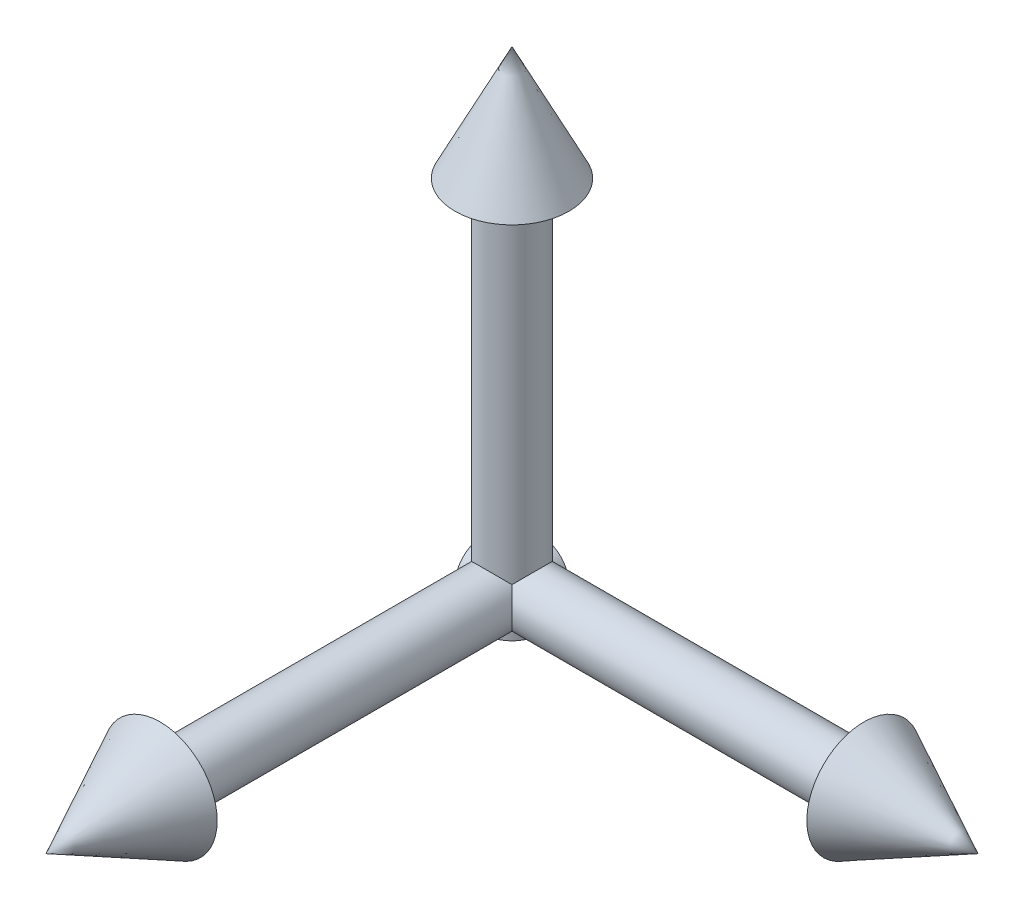
ISO-10303-21;
HEADER;
FILE_DESCRIPTION(('STEP AP214'),'2;1');
FILE_NAME('part.step','',(''),(''),'','','');
FILE_SCHEMA(('AUTOMOTIVE_DESIGN { 1 0 10303 214 1 1 1 1 }'));
ENDSEC;
DATA;
#1=APPLICATION_CONTEXT('core data for automotive mechanical design processes');
#2=APPLICATION_PROTOCOL_DEFINITION('international standard','automotive_design',2000,#1);
#3=PRODUCT_CONTEXT('',#1,'mechanical');
#4=PRODUCT('Part','Part','',(#3));
#5=PRODUCT_RELATED_PRODUCT_CATEGORY('part','',(#4));
#6=PRODUCT_DEFINITION_FORMATION('','',#4);
#7=PRODUCT_DEFINITION_CONTEXT('part definition',#1,'design');
#8=PRODUCT_DEFINITION('design','',#6,#7);
#9=PRODUCT_DEFINITION_SHAPE('','',#8);
#10=(LENGTH_UNIT() NAMED_UNIT(*) SI_UNIT(.MILLI.,.METRE.));
#11=(NAMED_UNIT(*) PLANE_ANGLE_UNIT() SI_UNIT($,.RADIAN.));
#12=(NAMED_UNIT(*) SI_UNIT($,.STERADIAN.) SOLID_ANGLE_UNIT());
#13=UNCERTAINTY_MEASURE_WITH_UNIT(LENGTH_MEASURE(1.E-05),#10,'distance_accuracy_value','');
#14=(GEOMETRIC_REPRESENTATION_CONTEXT(3) GLOBAL_UNCERTAINTY_ASSIGNED_CONTEXT((#13)) GLOBAL_UNIT_ASSIGNED_CONTEXT((#10,
#11,#12)) REPRESENTATION_CONTEXT('',''));
#15=CARTESIAN_POINT('',(0.,0.,0.));
#16=DIRECTION('',(0.,0.,1.));
#17=DIRECTION('',(1.,0.,0.));
#18=AXIS2_PLACEMENT_3D('',#15,#16,#17);
#19=CARTESIAN_POINT('',(55.5,4.5,0.));
#20=DIRECTION('',(-1.,0.,0.));
#21=DIRECTION('',(0.,-0.285012258072763,-0.958523871767555));
#22=AXIS2_PLACEMENT_3D('',#19,#20,#21);
#23=CYLINDRICAL_SURFACE('',#22,4.5);
#24=CARTESIAN_POINT('',(55.5,4.5,0.));
#25=DIRECTION('',(1.,0.,0.));
#26=DIRECTION('',(0.,0.285012258072763,0.958523871767555));
#27=AXIS2_PLACEMENT_3D('',#24,#25,#26);
#28=CIRCLE('',#27,4.5);
#29=CARTESIAN_POINT('',(55.5,5.78255516132744,4.31335742295393));
#30=VERTEX_POINT('',#29);
#31=EDGE_CURVE('E12',#30,#30,#28,.T.);
#32=ORIENTED_EDGE('',*,*,#31,.F.);
#33=EDGE_LOOP('',(#32));
#34=FACE_BOUND('',#33,.T.);
#35=CARTESIAN_POINT('',(-4.49999999999996,4.49999999999995,0.));
#36=DIRECTION('',(1.,0.,0.));
#37=DIRECTION('',(0.,0.285012258072763,0.958523871767555));
#38=AXIS2_PLACEMENT_3D('',#35,#36,#37);
#39=CIRCLE('',#38,4.5);
#40=CARTESIAN_POINT('',(-4.49999999999996,5.78255516132739,4.31335742295394));
#41=VERTEX_POINT('',#40);
#42=EDGE_CURVE('E46',#41,#41,#39,.T.);
#43=ORIENTED_EDGE('',*,*,#42,.T.);
#44=EDGE_LOOP('',(#43));
#45=FACE_BOUND('',#44,.T.);
#46=ADVANCED_FACE('F43',(#34,#45),#23,.T.);
#47=CARTESIAN_POINT('',(-4.49999999999996,4.49999999999995,0.));
#48=DIRECTION('',(1.,0.,0.));
#49=DIRECTION('',(0.,0.285012258072763,0.958523871767555));
#50=AXIS2_PLACEMENT_3D('',#47,#48,#49);
#51=PLANE('',#50);
#52=ORIENTED_EDGE('',*,*,#42,.F.);
#53=EDGE_LOOP('',(#52));
#54=FACE_BOUND('',#53,.T.);
#55=ADVANCED_FACE('F60',(#54),#51,.F.);
#56=CARTESIAN_POINT('',(55.5,4.5,0.));
#57=DIRECTION('',(-1.,0.,0.));
#58=DIRECTION('',(0.,-0.285012258072763,-0.958523871767555));
#59=AXIS2_PLACEMENT_3D('',#56,#57,#58);
#60=PLANE('',#59);
#61=ORIENTED_EDGE('',*,*,#31,.T.);
#62=EDGE_LOOP('',(#61));
#63=FACE_BOUND('',#62,.T.);
#64=CARTESIAN_POINT('',(55.5,4.5,0.));
#65=DIRECTION('',(1.,0.,0.));
#66=DIRECTION('',(0.,0.285012258072763,0.958523871767555));
#67=AXIS2_PLACEMENT_3D('',#64,#65,#66);
#68=CIRCLE('',#67,9.);
#69=CARTESIAN_POINT('',(55.5,7.06511032265487,8.62671484590793));
#70=VERTEX_POINT('',#69);
#71=EDGE_CURVE('E74',#70,#70,#68,.T.);
#72=ORIENTED_EDGE('',*,*,#71,.F.);
#73=EDGE_LOOP('',(#72));
#74=FACE_BOUND('',#73,.T.);
#75=ADVANCED_FACE('F54',(#63,#74),#60,.T.);
#76=CARTESIAN_POINT('',(73.5,4.50000000000001,0.));
#77=DIRECTION('',(-1.,0.,0.));
#78=DIRECTION('',(0.,-0.285012258072763,-0.958523871767555));
#79=AXIS2_PLACEMENT_3D('',#76,#77,#78);
#80=CONICAL_SURFACE('',#79,0.,0.463647609000806);
#81=ORIENTED_EDGE('',*,*,#71,.T.);
#82=EDGE_LOOP('',(#81));
#83=FACE_BOUND('',#82,.T.);
#84=CARTESIAN_POINT('',(73.5,4.50000000000001,0.));
#85=VERTEX_POINT('',#84);
#86=VERTEX_LOOP('',#85);
#87=FACE_BOUND('',#86,.T.);
#88=ADVANCED_FACE('F52',(#83,#87),#80,.T.);
#89=CLOSED_SHELL('',(#46,#55,#75,#88));
#90=MANIFOLD_SOLID_BREP('B2',#89);
#91=CARTESIAN_POINT('',(0.,60.,0.));
#92=DIRECTION('',(0.,-1.,0.));
#93=DIRECTION('',(0.000915131680972299,0.,-0.999999581266916));
#94=AXIS2_PLACEMENT_3D('',#91,#92,#93);
#95=CYLINDRICAL_SURFACE('',#94,4.5);
#96=CARTESIAN_POINT('',(0.,60.,0.));
#97=DIRECTION('',(0.,1.,0.));
#98=DIRECTION('',(-0.000915131680972299,0.,0.999999581266916));
#99=AXIS2_PLACEMENT_3D('',#96,#97,#98);
#100=CIRCLE('',#99,4.5);
#101=CARTESIAN_POINT('',(-0.00411809256437535,60.,4.49999811570112));
#102=VERTEX_POINT('',#101);
#103=EDGE_CURVE('E41',#102,#102,#100,.T.);
#104=ORIENTED_EDGE('',*,*,#103,.F.);
#105=EDGE_LOOP('',(#104));
#106=FACE_BOUND('',#105,.T.);
#107=CARTESIAN_POINT('',(0.,0.,0.));
#108=DIRECTION('',(0.,1.,0.));
#109=DIRECTION('',(-0.000915131680972299,0.,0.999999581266916));
#110=AXIS2_PLACEMENT_3D('',#107,#108,#109);
#111=CIRCLE('',#110,4.5);
#112=CARTESIAN_POINT('',(-0.00411809256437534,0.,4.49999811570112));
#113=VERTEX_POINT('',#112);
#114=EDGE_CURVE('E112',#113,#113,#111,.T.);
#115=ORIENTED_EDGE('',*,*,#114,.T.);
#116=EDGE_LOOP('',(#115));
#117=FACE_BOUND('',#116,.T.);
#118=ADVANCED_FACE('F109',(#106,#117),#95,.T.);
#119=CARTESIAN_POINT('',(0.,0.,0.));
#120=DIRECTION('',(0.,1.,0.));
#121=DIRECTION('',(-0.000915131680972299,0.,0.999999581266916));
#122=AXIS2_PLACEMENT_3D('',#119,#120,#121);
#123=PLANE('',#122);
#124=ORIENTED_EDGE('',*,*,#114,.F.);
#125=EDGE_LOOP('',(#124));
#126=FACE_BOUND('',#125,.T.);
#127=ADVANCED_FACE('F126',(#126),#123,.F.);
#128=CARTESIAN_POINT('',(0.,60.,0.));
#129=DIRECTION('',(0.,-1.,0.));
#130=DIRECTION('',(0.000915131680972299,0.,-0.999999581266916));
#131=AXIS2_PLACEMENT_3D('',#128,#129,#130);
#132=PLANE('',#131);
#133=ORIENTED_EDGE('',*,*,#103,.T.);
#134=EDGE_LOOP('',(#133));
#135=FACE_BOUND('',#134,.T.);
#136=CARTESIAN_POINT('',(0.,60.,0.));
#137=DIRECTION('',(0.,1.,0.));
#138=DIRECTION('',(-0.000915131680972299,0.,0.999999581266916));
#139=AXIS2_PLACEMENT_3D('',#136,#137,#138);
#140=CIRCLE('',#139,9.);
#141=CARTESIAN_POINT('',(-0.00823618512875069,60.,8.99999623140224));
#142=VERTEX_POINT('',#141);
#143=EDGE_CURVE('E140',#142,#142,#140,.T.);
#144=ORIENTED_EDGE('',*,*,#143,.F.);
#145=EDGE_LOOP('',(#144));
#146=FACE_BOUND('',#145,.T.);
#147=ADVANCED_FACE('F120',(#135,#146),#132,.T.);
#148=CARTESIAN_POINT('',(0.,78.,0.));
#149=DIRECTION('',(0.,-1.,0.));
#150=DIRECTION('',(0.000915131680972299,0.,-0.999999581266916));
#151=AXIS2_PLACEMENT_3D('',#148,#149,#150);
#152=CONICAL_SURFACE('',#151,0.,0.463647609000806);
#153=ORIENTED_EDGE('',*,*,#143,.T.);
#154=EDGE_LOOP('',(#153));
#155=FACE_BOUND('',#154,.T.);
#156=CARTESIAN_POINT('',(0.,78.,0.));
#157=VERTEX_POINT('',#156);
#158=VERTEX_LOOP('',#157);
#159=FACE_BOUND('',#158,.T.);
#160=ADVANCED_FACE('F118',(#155,#159),#152,.T.);
#161=CLOSED_SHELL('',(#118,#127,#147,#160));
#162=MANIFOLD_SOLID_BREP('B6',#161);
#163=CARTESIAN_POINT('',(0.,4.5,55.5));
#164=DIRECTION('',(0.,0.,-1.));
#165=DIRECTION('',(0.750304849354333,0.661092000432142,0.));
#166=AXIS2_PLACEMENT_3D('',#163,#164,#165);
#167=CYLINDRICAL_SURFACE('',#166,4.5);
#168=CARTESIAN_POINT('',(0.,4.5,55.5));
#169=DIRECTION('',(0.,0.,1.));
#170=DIRECTION('',(-0.750304849354333,-0.661092000432142,0.));
#171=AXIS2_PLACEMENT_3D('',#168,#169,#170);
#172=CIRCLE('',#171,4.5);
#173=CARTESIAN_POINT('',(-3.37637182209446,1.52508599805536,55.5));
#174=VERTEX_POINT('',#173);
#175=EDGE_CURVE('E107',#174,#174,#172,.T.);
#176=ORIENTED_EDGE('',*,*,#175,.F.);
#177=EDGE_LOOP('',(#176));
#178=FACE_BOUND('',#177,.T.);
#179=CARTESIAN_POINT('',(0.,4.50000000000001,-4.50000000000002));
#180=DIRECTION('',(0.,0.,1.));
#181=DIRECTION('',(-0.750304849354333,-0.661092000432142,0.));
#182=AXIS2_PLACEMENT_3D('',#179,#180,#181);
#183=CIRCLE('',#182,4.5);
#184=CARTESIAN_POINT('',(-3.37637182209452,1.52508599805537,-4.50000000000001));
#185=VERTEX_POINT('',#184);
#186=EDGE_CURVE('E169',#185,#185,#183,.T.);
#187=ORIENTED_EDGE('',*,*,#186,.T.);
#188=EDGE_LOOP('',(#187));
#189=FACE_BOUND('',#188,.T.);
#190=ADVANCED_FACE('F166',(#178,#189),#167,.T.);
#191=CARTESIAN_POINT('',(0.,4.50000000000001,-4.50000000000002));
#192=DIRECTION('',(0.,0.,1.));
#193=DIRECTION('',(-0.750304849354333,-0.661092000432142,0.));
#194=AXIS2_PLACEMENT_3D('',#191,#192,#193);
#195=PLANE('',#194);
#196=ORIENTED_EDGE('',*,*,#186,.F.);
#197=EDGE_LOOP('',(#196));
#198=FACE_BOUND('',#197,.T.);
#199=ADVANCED_FACE('F183',(#198),#195,.F.);
#200=CARTESIAN_POINT('',(0.,4.5,55.5));
#201=DIRECTION('',(0.,0.,-1.));
#202=DIRECTION('',(0.750304849354333,0.661092000432142,0.));
#203=AXIS2_PLACEMENT_3D('',#200,#201,#202);
#204=PLANE('',#203);
#205=ORIENTED_EDGE('',*,*,#175,.T.);
#206=EDGE_LOOP('',(#205));
#207=FACE_BOUND('',#206,.T.);
#208=CARTESIAN_POINT('',(0.,4.5,55.5));
#209=DIRECTION('',(0.,0.,1.));
#210=DIRECTION('',(-0.750304849354333,-0.661092000432142,0.));
#211=AXIS2_PLACEMENT_3D('',#208,#209,#210);
#212=CIRCLE('',#211,9.);
#213=CARTESIAN_POINT('',(-6.75274364418896,-1.44982800388928,55.5));
#214=VERTEX_POINT('',#213);
#215=EDGE_CURVE('E197',#214,#214,#212,.T.);
#216=ORIENTED_EDGE('',*,*,#215,.F.);
#217=EDGE_LOOP('',(#216));
#218=FACE_BOUND('',#217,.T.);
#219=ADVANCED_FACE('F177',(#207,#218),#204,.T.);
#220=CARTESIAN_POINT('',(0.,4.5,73.5));
#221=DIRECTION('',(0.,0.,-1.));
#222=DIRECTION('',(0.750304849354333,0.661092000432142,0.));
#223=AXIS2_PLACEMENT_3D('',#220,#221,#222);
#224=CONICAL_SURFACE('',#223,0.,0.463647609000806);
#225=ORIENTED_EDGE('',*,*,#215,.T.);
#226=EDGE_LOOP('',(#225));
#227=FACE_BOUND('',#226,.T.);
#228=CARTESIAN_POINT('',(0.,4.5,73.5));
#229=VERTEX_POINT('',#228);
#230=VERTEX_LOOP('',#229);
#231=FACE_BOUND('',#230,.T.);
#232=ADVANCED_FACE('F175',(#227,#231),#224,.T.);
#233=CLOSED_SHELL('',(#190,#199,#219,#232));
#234=MANIFOLD_SOLID_BREP('B35',#233);
#235=ADVANCED_BREP_SHAPE_REPRESENTATION('',(#18,#90,#162,#234),#14);
#236=SHAPE_DEFINITION_REPRESENTATION(#9,#235);
ENDSEC;
END-ISO-10303-21;
